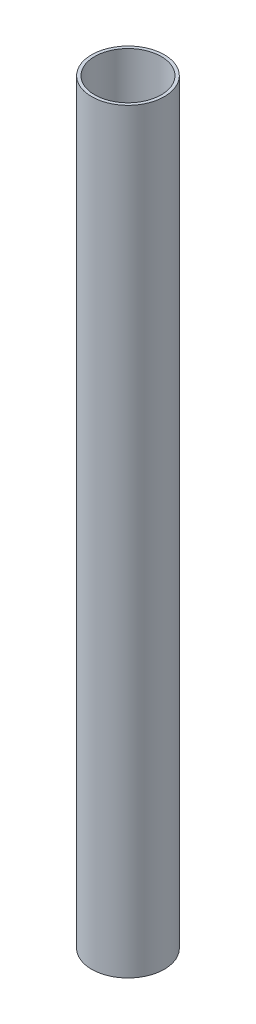
ISO-10303-21;
HEADER;
FILE_DESCRIPTION(('STEP AP214'),'2;1');
FILE_NAME('part.step','',(''),(''),'','','');
FILE_SCHEMA(('AUTOMOTIVE_DESIGN { 1 0 10303 214 1 1 1 1 }'));
ENDSEC;
DATA;
#1=APPLICATION_CONTEXT('core data for automotive mechanical design processes');
#2=APPLICATION_PROTOCOL_DEFINITION('international standard','automotive_design',2000,#1);
#3=PRODUCT_CONTEXT('',#1,'mechanical');
#4=PRODUCT('Part','Part','',(#3));
#5=PRODUCT_RELATED_PRODUCT_CATEGORY('part','',(#4));
#6=PRODUCT_DEFINITION_FORMATION('','',#4);
#7=PRODUCT_DEFINITION_CONTEXT('part definition',#1,'design');
#8=PRODUCT_DEFINITION('design','',#6,#7);
#9=PRODUCT_DEFINITION_SHAPE('','',#8);
#10=(LENGTH_UNIT() NAMED_UNIT(*) SI_UNIT(.MILLI.,.METRE.));
#11=(NAMED_UNIT(*) PLANE_ANGLE_UNIT() SI_UNIT($,.RADIAN.));
#12=(NAMED_UNIT(*) SI_UNIT($,.STERADIAN.) SOLID_ANGLE_UNIT());
#13=UNCERTAINTY_MEASURE_WITH_UNIT(LENGTH_MEASURE(1.E-05),#10,'distance_accuracy_value','');
#14=(GEOMETRIC_REPRESENTATION_CONTEXT(3) GLOBAL_UNCERTAINTY_ASSIGNED_CONTEXT((#13)) GLOBAL_UNIT_ASSIGNED_CONTEXT((#10,
#11,#12)) REPRESENTATION_CONTEXT('',''));
#15=CARTESIAN_POINT('',(0.,0.,0.));
#16=DIRECTION('',(0.,0.,1.));
#17=DIRECTION('',(1.,0.,0.));
#18=AXIS2_PLACEMENT_3D('',#15,#16,#17);
#19=CARTESIAN_POINT('',(0.,1750.,0.));
#20=DIRECTION('',(0.,1.,0.));
#21=DIRECTION('',(0.,0.,1.));
#22=AXIS2_PLACEMENT_3D('',#19,#20,#21);
#23=PLANE('',#22);
#24=CARTESIAN_POINT('',(0.,1750.,0.));
#25=DIRECTION('',(0.,1.,0.));
#26=DIRECTION('',(0.,0.,1.));
#27=AXIS2_PLACEMENT_3D('',#24,#25,#26);
#28=CIRCLE('',#27,84.1375);
#29=CARTESIAN_POINT('',(0.,1750.,84.1375));
#30=VERTEX_POINT('',#29);
#31=EDGE_CURVE('E10',#30,#30,#28,.T.);
#32=ORIENTED_EDGE('',*,*,#31,.T.);
#33=EDGE_LOOP('',(#32));
#34=FACE_BOUND('',#33,.T.);
#35=CARTESIAN_POINT('',(0.,1750.,0.));
#36=DIRECTION('',(0.,1.,0.));
#37=DIRECTION('',(0.,0.,1.));
#38=AXIS2_PLACEMENT_3D('',#35,#36,#37);
#39=CIRCLE('',#38,77.0255);
#40=CARTESIAN_POINT('',(0.,1750.,77.0255));
#41=VERTEX_POINT('',#40);
#42=EDGE_CURVE('E50',#41,#41,#39,.T.);
#43=ORIENTED_EDGE('',*,*,#42,.F.);
#44=EDGE_LOOP('',(#43));
#45=FACE_BOUND('',#44,.T.);
#46=ADVANCED_FACE('F37',(#34,#45),#23,.T.);
#47=CARTESIAN_POINT('',(0.,0.,0.));
#48=DIRECTION('',(0.,1.,0.));
#49=DIRECTION('',(0.,0.,1.));
#50=AXIS2_PLACEMENT_3D('',#47,#48,#49);
#51=PLANE('',#50);
#52=CARTESIAN_POINT('',(0.,0.,0.));
#53=DIRECTION('',(0.,1.,0.));
#54=DIRECTION('',(0.,0.,1.));
#55=AXIS2_PLACEMENT_3D('',#52,#53,#54);
#56=CIRCLE('',#55,84.1375);
#57=CARTESIAN_POINT('',(0.,0.,84.1375));
#58=VERTEX_POINT('',#57);
#59=EDGE_CURVE('E41',#58,#58,#56,.T.);
#60=ORIENTED_EDGE('',*,*,#59,.F.);
#61=EDGE_LOOP('',(#60));
#62=FACE_BOUND('',#61,.T.);
#63=CARTESIAN_POINT('',(0.,0.,0.));
#64=DIRECTION('',(0.,1.,0.));
#65=DIRECTION('',(0.,0.,1.));
#66=AXIS2_PLACEMENT_3D('',#63,#64,#65);
#67=CIRCLE('',#66,77.0255);
#68=CARTESIAN_POINT('',(0.,0.,77.0255));
#69=VERTEX_POINT('',#68);
#70=EDGE_CURVE('E52',#69,#69,#67,.T.);
#71=ORIENTED_EDGE('',*,*,#70,.T.);
#72=EDGE_LOOP('',(#71));
#73=FACE_BOUND('',#72,.T.);
#74=ADVANCED_FACE('F64',(#62,#73),#51,.F.);
#75=CARTESIAN_POINT('',(0.,1750.,0.));
#76=DIRECTION('',(0.,-1.,0.));
#77=DIRECTION('',(0.,0.,-1.));
#78=AXIS2_PLACEMENT_3D('',#75,#76,#77);
#79=CYLINDRICAL_SURFACE('',#78,84.1375);
#80=ORIENTED_EDGE('',*,*,#31,.F.);
#81=EDGE_LOOP('',(#80));
#82=FACE_BOUND('',#81,.T.);
#83=ORIENTED_EDGE('',*,*,#59,.T.);
#84=EDGE_LOOP('',(#83));
#85=FACE_BOUND('',#84,.T.);
#86=ADVANCED_FACE('F39',(#82,#85),#79,.T.);
#87=CARTESIAN_POINT('',(0.,1750.,0.));
#88=DIRECTION('',(0.,-1.,0.));
#89=DIRECTION('',(0.,0.,-1.));
#90=AXIS2_PLACEMENT_3D('',#87,#88,#89);
#91=CYLINDRICAL_SURFACE('',#90,77.0255);
#92=ORIENTED_EDGE('',*,*,#42,.T.);
#93=EDGE_LOOP('',(#92));
#94=FACE_BOUND('',#93,.T.);
#95=ORIENTED_EDGE('',*,*,#70,.F.);
#96=EDGE_LOOP('',(#95));
#97=FACE_BOUND('',#96,.T.);
#98=ADVANCED_FACE('F60',(#94,#97),#91,.F.);
#99=CLOSED_SHELL('',(#46,#74,#86,#98));
#100=MANIFOLD_SOLID_BREP('B2',#99);
#101=ADVANCED_BREP_SHAPE_REPRESENTATION('',(#18,#100),#14);
#102=SHAPE_DEFINITION_REPRESENTATION(#9,#101);
ENDSEC;
END-ISO-10303-21;
